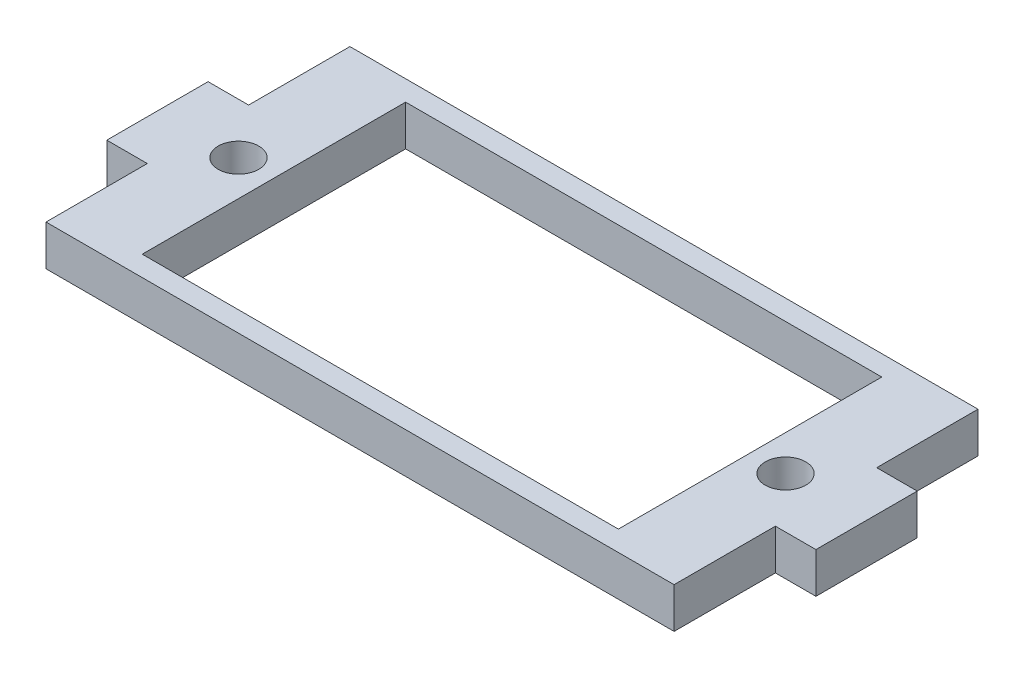
ISO-10303-21;
HEADER;
FILE_DESCRIPTION(('STEP AP214'),'2;1');
FILE_NAME('part.step','',(''),(''),'','','');
FILE_SCHEMA(('AUTOMOTIVE_DESIGN { 1 0 10303 214 1 1 1 1 }'));
ENDSEC;
DATA;
#1=APPLICATION_CONTEXT('core data for automotive mechanical design processes');
#2=APPLICATION_PROTOCOL_DEFINITION('international standard','automotive_design',2000,#1);
#3=PRODUCT_CONTEXT('',#1,'mechanical');
#4=PRODUCT('Part','Part','',(#3));
#5=PRODUCT_RELATED_PRODUCT_CATEGORY('part','',(#4));
#6=PRODUCT_DEFINITION_FORMATION('','',#4);
#7=PRODUCT_DEFINITION_CONTEXT('part definition',#1,'design');
#8=PRODUCT_DEFINITION('design','',#6,#7);
#9=PRODUCT_DEFINITION_SHAPE('','',#8);
#10=(LENGTH_UNIT() NAMED_UNIT(*) SI_UNIT(.MILLI.,.METRE.));
#11=(NAMED_UNIT(*) PLANE_ANGLE_UNIT() SI_UNIT($,.RADIAN.));
#12=(NAMED_UNIT(*) SI_UNIT($,.STERADIAN.) SOLID_ANGLE_UNIT());
#13=UNCERTAINTY_MEASURE_WITH_UNIT(LENGTH_MEASURE(1.E-05),#10,'distance_accuracy_value','');
#14=(GEOMETRIC_REPRESENTATION_CONTEXT(3) GLOBAL_UNCERTAINTY_ASSIGNED_CONTEXT((#13)) GLOBAL_UNIT_ASSIGNED_CONTEXT((#10,
#11,#12)) REPRESENTATION_CONTEXT('',''));
#15=CARTESIAN_POINT('',(0.,0.,0.));
#16=DIRECTION('',(0.,0.,1.));
#17=DIRECTION('',(1.,0.,0.));
#18=AXIS2_PLACEMENT_3D('',#15,#16,#17);
#19=CARTESIAN_POINT('',(0.,2.,0.));
#20=DIRECTION('',(0.,1.,0.));
#21=DIRECTION('',(0.,0.,1.));
#22=AXIS2_PLACEMENT_3D('',#19,#20,#21);
#23=PLANE('',#22);
#24=DIRECTION('',(0.,0.,-1.));
#25=VECTOR('',#24,1.);
#26=CARTESIAN_POINT('',(-15.5,2.,-7.50000000000001));
#27=LINE('',#26,#25);
#28=CARTESIAN_POINT('',(-15.5,2.,-2.50000000000001));
#29=VERTEX_POINT('',#28);
#30=CARTESIAN_POINT('',(-15.5,2.,-7.5));
#31=VERTEX_POINT('',#30);
#32=EDGE_CURVE('E51',#29,#31,#27,.T.);
#33=ORIENTED_EDGE('',*,*,#32,.F.);
#34=DIRECTION('',(1.,0.,0.));
#35=VECTOR('',#34,1.);
#36=CARTESIAN_POINT('',(-17.5,2.,-2.50000000000001));
#37=LINE('',#36,#35);
#38=CARTESIAN_POINT('',(-17.5,2.,-2.50000000000001));
#39=VERTEX_POINT('',#38);
#40=EDGE_CURVE('E510',#39,#29,#37,.T.);
#41=ORIENTED_EDGE('',*,*,#40,.F.);
#42=DIRECTION('',(0.,0.,1.));
#43=VECTOR('',#42,1.);
#44=CARTESIAN_POINT('',(-17.5,2.,7.5));
#45=LINE('',#44,#43);
#46=CARTESIAN_POINT('',(-17.5,2.,2.49999999999999));
#47=VERTEX_POINT('',#46);
#48=EDGE_CURVE('E166',#39,#47,#45,.T.);
#49=ORIENTED_EDGE('',*,*,#48,.T.);
#50=DIRECTION('',(-1.,0.,0.));
#51=VECTOR('',#50,1.);
#52=CARTESIAN_POINT('',(-17.5,2.,2.49999999999999));
#53=LINE('',#52,#51);
#54=CARTESIAN_POINT('',(-15.5,2.,2.49999999999999));
#55=VERTEX_POINT('',#54);
#56=EDGE_CURVE('E346',#55,#47,#53,.T.);
#57=ORIENTED_EDGE('',*,*,#56,.F.);
#58=DIRECTION('',(0.,0.,-1.));
#59=VECTOR('',#58,1.);
#60=CARTESIAN_POINT('',(-15.5,2.,7.49999999999999));
#61=LINE('',#60,#59);
#62=CARTESIAN_POINT('',(-15.5,2.,7.49999999999999));
#63=VERTEX_POINT('',#62);
#64=EDGE_CURVE('E320',#63,#55,#61,.T.);
#65=ORIENTED_EDGE('',*,*,#64,.F.);
#66=DIRECTION('',(1.,0.,0.));
#67=VECTOR('',#66,1.);
#68=CARTESIAN_POINT('',(17.5,2.,7.5));
#69=LINE('',#68,#67);
#70=CARTESIAN_POINT('',(15.5,2.,7.5));
#71=VERTEX_POINT('',#70);
#72=EDGE_CURVE('E191',#63,#71,#69,.T.);
#73=ORIENTED_EDGE('',*,*,#72,.T.);
#74=DIRECTION('',(0.,0.,1.));
#75=VECTOR('',#74,1.);
#76=CARTESIAN_POINT('',(15.5,2.,7.5));
#77=LINE('',#76,#75);
#78=CARTESIAN_POINT('',(15.5,2.,2.5));
#79=VERTEX_POINT('',#78);
#80=EDGE_CURVE('E318',#79,#71,#77,.T.);
#81=ORIENTED_EDGE('',*,*,#80,.F.);
#82=DIRECTION('',(-1.,0.,0.));
#83=VECTOR('',#82,1.);
#84=CARTESIAN_POINT('',(17.5,2.,2.5));
#85=LINE('',#84,#83);
#86=CARTESIAN_POINT('',(17.5,2.,2.5));
#87=VERTEX_POINT('',#86);
#88=EDGE_CURVE('E207',#87,#79,#85,.T.);
#89=ORIENTED_EDGE('',*,*,#88,.F.);
#90=DIRECTION('',(0.,0.,-1.));
#91=VECTOR('',#90,1.);
#92=CARTESIAN_POINT('',(17.5,2.,7.5));
#93=LINE('',#92,#91);
#94=CARTESIAN_POINT('',(17.5,2.,-2.5));
#95=VERTEX_POINT('',#94);
#96=EDGE_CURVE('E43',#87,#95,#93,.T.);
#97=ORIENTED_EDGE('',*,*,#96,.T.);
#98=DIRECTION('',(1.,0.,0.));
#99=VECTOR('',#98,1.);
#100=CARTESIAN_POINT('',(17.5,2.,-2.5));
#101=LINE('',#100,#99);
#102=CARTESIAN_POINT('',(15.5,2.,-2.5));
#103=VERTEX_POINT('',#102);
#104=EDGE_CURVE('E204',#103,#95,#101,.T.);
#105=ORIENTED_EDGE('',*,*,#104,.F.);
#106=DIRECTION('',(0.,0.,1.));
#107=VECTOR('',#106,1.);
#108=CARTESIAN_POINT('',(15.5,2.,-7.5));
#109=LINE('',#108,#107);
#110=CARTESIAN_POINT('',(15.5,2.,-7.5));
#111=VERTEX_POINT('',#110);
#112=EDGE_CURVE('E216',#111,#103,#109,.T.);
#113=ORIENTED_EDGE('',*,*,#112,.F.);
#114=DIRECTION('',(-1.,0.,0.));
#115=VECTOR('',#114,1.);
#116=CARTESIAN_POINT('',(17.5,2.,-7.5));
#117=LINE('',#116,#115);
#118=EDGE_CURVE('E11',#111,#31,#117,.T.);
#119=ORIENTED_EDGE('',*,*,#118,.T.);
#120=EDGE_LOOP('',(#33,#41,#49,#57,#65,#73,#81,#89,#97,#105,#113,#119));
#121=FACE_BOUND('',#120,.T.);
#122=CARTESIAN_POINT('',(-13.5,2.,0.));
#123=DIRECTION('',(0.,1.,0.));
#124=DIRECTION('',(0.,0.,1.));
#125=AXIS2_PLACEMENT_3D('',#122,#123,#124);
#126=CIRCLE('',#125,1.);
#127=CARTESIAN_POINT('',(-13.5,2.,1.));
#128=VERTEX_POINT('',#127);
#129=EDGE_CURVE('E233',#128,#128,#126,.T.);
#130=ORIENTED_EDGE('',*,*,#129,.F.);
#131=EDGE_LOOP('',(#130));
#132=FACE_BOUND('',#131,.T.);
#133=DIRECTION('',(1.,0.,0.));
#134=VECTOR('',#133,1.);
#135=CARTESIAN_POINT('',(11.75,2.,6.5));
#136=LINE('',#135,#134);
#137=CARTESIAN_POINT('',(-11.75,2.,6.5));
#138=VERTEX_POINT('',#137);
#139=CARTESIAN_POINT('',(11.75,2.,6.5));
#140=VERTEX_POINT('',#139);
#141=EDGE_CURVE('E241',#138,#140,#136,.T.);
#142=ORIENTED_EDGE('',*,*,#141,.F.);
#143=DIRECTION('',(0.,0.,1.));
#144=VECTOR('',#143,1.);
#145=CARTESIAN_POINT('',(-11.75,2.,6.5));
#146=LINE('',#145,#144);
#147=CARTESIAN_POINT('',(-11.75,2.,-6.5));
#148=VERTEX_POINT('',#147);
#149=EDGE_CURVE('E239',#148,#138,#146,.T.);
#150=ORIENTED_EDGE('',*,*,#149,.F.);
#151=DIRECTION('',(-1.,0.,0.));
#152=VECTOR('',#151,1.);
#153=CARTESIAN_POINT('',(11.75,2.,-6.5));
#154=LINE('',#153,#152);
#155=CARTESIAN_POINT('',(11.75,2.,-6.5));
#156=VERTEX_POINT('',#155);
#157=EDGE_CURVE('E247',#156,#148,#154,.T.);
#158=ORIENTED_EDGE('',*,*,#157,.F.);
#159=DIRECTION('',(0.,0.,-1.));
#160=VECTOR('',#159,1.);
#161=CARTESIAN_POINT('',(11.75,2.,6.5));
#162=LINE('',#161,#160);
#163=EDGE_CURVE('E244',#140,#156,#162,.T.);
#164=ORIENTED_EDGE('',*,*,#163,.F.);
#165=EDGE_LOOP('',(#142,#150,#158,#164));
#166=FACE_BOUND('',#165,.T.);
#167=CARTESIAN_POINT('',(13.5,2.,0.));
#168=DIRECTION('',(0.,1.,0.));
#169=DIRECTION('',(0.,0.,-1.));
#170=AXIS2_PLACEMENT_3D('',#167,#168,#169);
#171=CIRCLE('',#170,1.);
#172=CARTESIAN_POINT('',(13.5,2.,-0.999999999999995));
#173=VERTEX_POINT('',#172);
#174=EDGE_CURVE('E222',#173,#173,#171,.T.);
#175=ORIENTED_EDGE('',*,*,#174,.F.);
#176=EDGE_LOOP('',(#175));
#177=FACE_BOUND('',#176,.T.);
#178=ADVANCED_FACE('F34',(#121,#132,#166,#177),#23,.T.);
#179=CARTESIAN_POINT('',(0.,0.,0.));
#180=DIRECTION('',(0.,1.,0.));
#181=DIRECTION('',(0.,0.,1.));
#182=AXIS2_PLACEMENT_3D('',#179,#180,#181);
#183=PLANE('',#182);
#184=CARTESIAN_POINT('',(-13.5,0.,0.));
#185=DIRECTION('',(0.,1.,0.));
#186=DIRECTION('',(0.,0.,1.));
#187=AXIS2_PLACEMENT_3D('',#184,#185,#186);
#188=CIRCLE('',#187,1.);
#189=CARTESIAN_POINT('',(-13.5,0.,1.));
#190=VERTEX_POINT('',#189);
#191=EDGE_CURVE('E231',#190,#190,#188,.T.);
#192=ORIENTED_EDGE('',*,*,#191,.T.);
#193=EDGE_LOOP('',(#192));
#194=FACE_BOUND('',#193,.T.);
#195=DIRECTION('',(1.,0.,0.));
#196=VECTOR('',#195,1.);
#197=CARTESIAN_POINT('',(-17.5,0.,-2.50000000000001));
#198=LINE('',#197,#196);
#199=CARTESIAN_POINT('',(-17.5,0.,-2.50000000000001));
#200=VERTEX_POINT('',#199);
#201=CARTESIAN_POINT('',(-15.5,0.,-2.50000000000001));
#202=VERTEX_POINT('',#201);
#203=EDGE_CURVE('E148',#200,#202,#198,.T.);
#204=ORIENTED_EDGE('',*,*,#203,.T.);
#205=DIRECTION('',(0.,0.,-1.));
#206=VECTOR('',#205,1.);
#207=CARTESIAN_POINT('',(-15.5,0.,-7.50000000000001));
#208=LINE('',#207,#206);
#209=CARTESIAN_POINT('',(-15.5,0.,-7.50000000000001));
#210=VERTEX_POINT('',#209);
#211=EDGE_CURVE('E159',#202,#210,#208,.T.);
#212=ORIENTED_EDGE('',*,*,#211,.T.);
#213=DIRECTION('',(-1.,0.,0.));
#214=VECTOR('',#213,1.);
#215=CARTESIAN_POINT('',(17.5,0.,-7.5));
#216=LINE('',#215,#214);
#217=CARTESIAN_POINT('',(15.5,0.,-7.5));
#218=VERTEX_POINT('',#217);
#219=EDGE_CURVE('E38',#218,#210,#216,.T.);
#220=ORIENTED_EDGE('',*,*,#219,.F.);
#221=DIRECTION('',(0.,0.,1.));
#222=VECTOR('',#221,1.);
#223=CARTESIAN_POINT('',(15.5,0.,-7.5));
#224=LINE('',#223,#222);
#225=CARTESIAN_POINT('',(15.5,0.,-2.5));
#226=VERTEX_POINT('',#225);
#227=EDGE_CURVE('E215',#218,#226,#224,.T.);
#228=ORIENTED_EDGE('',*,*,#227,.T.);
#229=DIRECTION('',(1.,0.,0.));
#230=VECTOR('',#229,1.);
#231=CARTESIAN_POINT('',(17.5,0.,-2.5));
#232=LINE('',#231,#230);
#233=CARTESIAN_POINT('',(17.5,0.,-2.5));
#234=VERTEX_POINT('',#233);
#235=EDGE_CURVE('E229',#226,#234,#232,.T.);
#236=ORIENTED_EDGE('',*,*,#235,.T.);
#237=DIRECTION('',(0.,0.,-1.));
#238=VECTOR('',#237,1.);
#239=CARTESIAN_POINT('',(17.5,0.,7.5));
#240=LINE('',#239,#238);
#241=CARTESIAN_POINT('',(17.5,0.,2.5));
#242=VERTEX_POINT('',#241);
#243=EDGE_CURVE('E176',#242,#234,#240,.T.);
#244=ORIENTED_EDGE('',*,*,#243,.F.);
#245=DIRECTION('',(-1.,0.,0.));
#246=VECTOR('',#245,1.);
#247=CARTESIAN_POINT('',(17.5,0.,2.5));
#248=LINE('',#247,#246);
#249=CARTESIAN_POINT('',(15.5,0.,2.5));
#250=VERTEX_POINT('',#249);
#251=EDGE_CURVE('E326',#242,#250,#248,.T.);
#252=ORIENTED_EDGE('',*,*,#251,.T.);
#253=DIRECTION('',(0.,0.,1.));
#254=VECTOR('',#253,1.);
#255=CARTESIAN_POINT('',(15.5,0.,7.5));
#256=LINE('',#255,#254);
#257=CARTESIAN_POINT('',(15.5,0.,7.5));
#258=VERTEX_POINT('',#257);
#259=EDGE_CURVE('E329',#250,#258,#256,.T.);
#260=ORIENTED_EDGE('',*,*,#259,.T.);
#261=DIRECTION('',(1.,0.,0.));
#262=VECTOR('',#261,1.);
#263=CARTESIAN_POINT('',(17.5,0.,7.5));
#264=LINE('',#263,#262);
#265=CARTESIAN_POINT('',(-15.5,0.,7.5));
#266=VERTEX_POINT('',#265);
#267=EDGE_CURVE('E173',#266,#258,#264,.T.);
#268=ORIENTED_EDGE('',*,*,#267,.F.);
#269=DIRECTION('',(0.,0.,-1.));
#270=VECTOR('',#269,1.);
#271=CARTESIAN_POINT('',(-15.5,0.,7.49999999999999));
#272=LINE('',#271,#270);
#273=CARTESIAN_POINT('',(-15.5,0.,2.49999999999999));
#274=VERTEX_POINT('',#273);
#275=EDGE_CURVE('E59',#266,#274,#272,.T.);
#276=ORIENTED_EDGE('',*,*,#275,.T.);
#277=DIRECTION('',(-1.,0.,0.));
#278=VECTOR('',#277,1.);
#279=CARTESIAN_POINT('',(-17.5,0.,2.49999999999999));
#280=LINE('',#279,#278);
#281=CARTESIAN_POINT('',(-17.5,0.,2.49999999999999));
#282=VERTEX_POINT('',#281);
#283=EDGE_CURVE('E172',#274,#282,#280,.T.);
#284=ORIENTED_EDGE('',*,*,#283,.T.);
#285=DIRECTION('',(0.,0.,1.));
#286=VECTOR('',#285,1.);
#287=CARTESIAN_POINT('',(-17.5,0.,7.5));
#288=LINE('',#287,#286);
#289=EDGE_CURVE('E164',#200,#282,#288,.T.);
#290=ORIENTED_EDGE('',*,*,#289,.F.);
#291=EDGE_LOOP('',(#204,#212,#220,#228,#236,#244,#252,#260,#268,#276,#284,#290));
#292=FACE_BOUND('',#291,.T.);
#293=DIRECTION('',(0.,0.,1.));
#294=VECTOR('',#293,1.);
#295=CARTESIAN_POINT('',(-11.75,0.,6.5));
#296=LINE('',#295,#294);
#297=CARTESIAN_POINT('',(-11.75,0.,-6.5));
#298=VERTEX_POINT('',#297);
#299=CARTESIAN_POINT('',(-11.75,0.,6.5));
#300=VERTEX_POINT('',#299);
#301=EDGE_CURVE('E236',#298,#300,#296,.T.);
#302=ORIENTED_EDGE('',*,*,#301,.T.);
#303=DIRECTION('',(1.,0.,0.));
#304=VECTOR('',#303,1.);
#305=CARTESIAN_POINT('',(11.75,0.,6.5));
#306=LINE('',#305,#304);
#307=CARTESIAN_POINT('',(11.75,0.,6.5));
#308=VERTEX_POINT('',#307);
#309=EDGE_CURVE('E252',#300,#308,#306,.T.);
#310=ORIENTED_EDGE('',*,*,#309,.T.);
#311=DIRECTION('',(0.,0.,-1.));
#312=VECTOR('',#311,1.);
#313=CARTESIAN_POINT('',(11.75,0.,6.5));
#314=LINE('',#313,#312);
#315=CARTESIAN_POINT('',(11.75,0.,-6.5));
#316=VERTEX_POINT('',#315);
#317=EDGE_CURVE('E255',#308,#316,#314,.T.);
#318=ORIENTED_EDGE('',*,*,#317,.T.);
#319=DIRECTION('',(-1.,0.,0.));
#320=VECTOR('',#319,1.);
#321=CARTESIAN_POINT('',(11.75,0.,-6.5));
#322=LINE('',#321,#320);
#323=EDGE_CURVE('E242',#316,#298,#322,.T.);
#324=ORIENTED_EDGE('',*,*,#323,.T.);
#325=EDGE_LOOP('',(#302,#310,#318,#324));
#326=FACE_BOUND('',#325,.T.);
#327=CARTESIAN_POINT('',(13.5,0.,0.));
#328=DIRECTION('',(0.,1.,0.));
#329=DIRECTION('',(0.,0.,-1.));
#330=AXIS2_PLACEMENT_3D('',#327,#328,#329);
#331=CIRCLE('',#330,1.);
#332=CARTESIAN_POINT('',(13.5,0.,-0.999999999999995));
#333=VERTEX_POINT('',#332);
#334=EDGE_CURVE('E219',#333,#333,#331,.T.);
#335=ORIENTED_EDGE('',*,*,#334,.T.);
#336=EDGE_LOOP('',(#335));
#337=FACE_BOUND('',#336,.T.);
#338=ADVANCED_FACE('F169',(#194,#292,#326,#337),#183,.F.);
#339=CARTESIAN_POINT('',(-17.5,2.,7.5));
#340=DIRECTION('',(1.,0.,0.));
#341=DIRECTION('',(0.,0.,-1.));
#342=AXIS2_PLACEMENT_3D('',#339,#340,#341);
#343=PLANE('',#342);
#344=ORIENTED_EDGE('',*,*,#48,.F.);
#345=DIRECTION('',(0.,1.,0.));
#346=VECTOR('',#345,1.);
#347=CARTESIAN_POINT('',(-17.5,0.,-2.50000000000001));
#348=LINE('',#347,#346);
#349=EDGE_CURVE('E152',#200,#39,#348,.T.);
#350=ORIENTED_EDGE('',*,*,#349,.F.);
#351=ORIENTED_EDGE('',*,*,#289,.T.);
#352=DIRECTION('',(0.,1.,0.));
#353=VECTOR('',#352,1.);
#354=CARTESIAN_POINT('',(-17.5,0.,2.49999999999999));
#355=LINE('',#354,#353);
#356=EDGE_CURVE('E331',#282,#47,#355,.T.);
#357=ORIENTED_EDGE('',*,*,#356,.T.);
#358=EDGE_LOOP('',(#344,#350,#351,#357));
#359=FACE_BOUND('',#358,.T.);
#360=ADVANCED_FACE('F36',(#359),#343,.F.);
#361=CARTESIAN_POINT('',(17.5,2.,7.5));
#362=DIRECTION('',(0.,0.,-1.));
#363=DIRECTION('',(-1.,0.,0.));
#364=AXIS2_PLACEMENT_3D('',#361,#362,#363);
#365=PLANE('',#364);
#366=ORIENTED_EDGE('',*,*,#72,.F.);
#367=DIRECTION('',(0.,1.,0.));
#368=VECTOR('',#367,1.);
#369=CARTESIAN_POINT('',(-15.5,0.,7.49999999999999));
#370=LINE('',#369,#368);
#371=EDGE_CURVE('E312',#266,#63,#370,.T.);
#372=ORIENTED_EDGE('',*,*,#371,.F.);
#373=ORIENTED_EDGE('',*,*,#267,.T.);
#374=DIRECTION('',(0.,1.,0.));
#375=VECTOR('',#374,1.);
#376=CARTESIAN_POINT('',(15.5,0.,7.5));
#377=LINE('',#376,#375);
#378=EDGE_CURVE('E315',#258,#71,#377,.T.);
#379=ORIENTED_EDGE('',*,*,#378,.T.);
#380=EDGE_LOOP('',(#366,#372,#373,#379));
#381=FACE_BOUND('',#380,.T.);
#382=ADVANCED_FACE('F299',(#381),#365,.F.);
#383=CARTESIAN_POINT('',(17.5,2.,7.5));
#384=DIRECTION('',(-1.,0.,0.));
#385=DIRECTION('',(0.,0.,1.));
#386=AXIS2_PLACEMENT_3D('',#383,#384,#385);
#387=PLANE('',#386);
#388=ORIENTED_EDGE('',*,*,#96,.F.);
#389=DIRECTION('',(0.,1.,0.));
#390=VECTOR('',#389,1.);
#391=CARTESIAN_POINT('',(17.5,0.,2.5));
#392=LINE('',#391,#390);
#393=EDGE_CURVE('E337',#242,#87,#392,.T.);
#394=ORIENTED_EDGE('',*,*,#393,.F.);
#395=ORIENTED_EDGE('',*,*,#243,.T.);
#396=DIRECTION('',(0.,1.,0.));
#397=VECTOR('',#396,1.);
#398=CARTESIAN_POINT('',(17.5,0.,-2.5));
#399=LINE('',#398,#397);
#400=EDGE_CURVE('E211',#234,#95,#399,.T.);
#401=ORIENTED_EDGE('',*,*,#400,.T.);
#402=EDGE_LOOP('',(#388,#394,#395,#401));
#403=FACE_BOUND('',#402,.T.);
#404=ADVANCED_FACE('F218',(#403),#387,.F.);
#405=CARTESIAN_POINT('',(17.5,2.,-7.5));
#406=DIRECTION('',(0.,0.,1.));
#407=DIRECTION('',(1.,0.,0.));
#408=AXIS2_PLACEMENT_3D('',#405,#406,#407);
#409=PLANE('',#408);
#410=ORIENTED_EDGE('',*,*,#219,.T.);
#411=DIRECTION('',(0.,1.,0.));
#412=VECTOR('',#411,1.);
#413=CARTESIAN_POINT('',(-15.5,0.,-7.50000000000001));
#414=LINE('',#413,#412);
#415=EDGE_CURVE('E344',#210,#31,#414,.T.);
#416=ORIENTED_EDGE('',*,*,#415,.T.);
#417=ORIENTED_EDGE('',*,*,#118,.F.);
#418=DIRECTION('',(0.,1.,0.));
#419=VECTOR('',#418,1.);
#420=CARTESIAN_POINT('',(15.5,0.,-7.5));
#421=LINE('',#420,#419);
#422=EDGE_CURVE('E224',#218,#111,#421,.T.);
#423=ORIENTED_EDGE('',*,*,#422,.F.);
#424=EDGE_LOOP('',(#410,#416,#417,#423));
#425=FACE_BOUND('',#424,.T.);
#426=ADVANCED_FACE('F302',(#425),#409,.F.);
#427=CARTESIAN_POINT('',(-11.75,2.,6.5));
#428=DIRECTION('',(1.,0.,0.));
#429=DIRECTION('',(0.,0.,-1.));
#430=AXIS2_PLACEMENT_3D('',#427,#428,#429);
#431=PLANE('',#430);
#432=ORIENTED_EDGE('',*,*,#301,.F.);
#433=DIRECTION('',(0.,-1.,0.));
#434=VECTOR('',#433,1.);
#435=CARTESIAN_POINT('',(-11.75,2.,-6.5));
#436=LINE('',#435,#434);
#437=EDGE_CURVE('E249',#148,#298,#436,.T.);
#438=ORIENTED_EDGE('',*,*,#437,.F.);
#439=ORIENTED_EDGE('',*,*,#149,.T.);
#440=DIRECTION('',(0.,-1.,0.));
#441=VECTOR('',#440,1.);
#442=CARTESIAN_POINT('',(-11.75,2.,6.5));
#443=LINE('',#442,#441);
#444=EDGE_CURVE('E174',#138,#300,#443,.T.);
#445=ORIENTED_EDGE('',*,*,#444,.T.);
#446=EDGE_LOOP('',(#432,#438,#439,#445));
#447=FACE_BOUND('',#446,.T.);
#448=ADVANCED_FACE('F276',(#447),#431,.T.);
#449=CARTESIAN_POINT('',(11.75,2.,6.5));
#450=DIRECTION('',(0.,0.,-1.));
#451=DIRECTION('',(-1.,0.,0.));
#452=AXIS2_PLACEMENT_3D('',#449,#450,#451);
#453=PLANE('',#452);
#454=ORIENTED_EDGE('',*,*,#309,.F.);
#455=ORIENTED_EDGE('',*,*,#444,.F.);
#456=ORIENTED_EDGE('',*,*,#141,.T.);
#457=DIRECTION('',(0.,-1.,0.));
#458=VECTOR('',#457,1.);
#459=CARTESIAN_POINT('',(11.75,2.,6.5));
#460=LINE('',#459,#458);
#461=EDGE_CURVE('E179',#140,#308,#460,.T.);
#462=ORIENTED_EDGE('',*,*,#461,.T.);
#463=EDGE_LOOP('',(#454,#455,#456,#462));
#464=FACE_BOUND('',#463,.T.);
#465=ADVANCED_FACE('F266',(#464),#453,.T.);
#466=CARTESIAN_POINT('',(11.75,2.,6.5));
#467=DIRECTION('',(-1.,0.,0.));
#468=DIRECTION('',(0.,0.,1.));
#469=AXIS2_PLACEMENT_3D('',#466,#467,#468);
#470=PLANE('',#469);
#471=ORIENTED_EDGE('',*,*,#317,.F.);
#472=ORIENTED_EDGE('',*,*,#461,.F.);
#473=ORIENTED_EDGE('',*,*,#163,.T.);
#474=DIRECTION('',(0.,-1.,0.));
#475=VECTOR('',#474,1.);
#476=CARTESIAN_POINT('',(11.75,2.,-6.5));
#477=LINE('',#476,#475);
#478=EDGE_CURVE('E262',#156,#316,#477,.T.);
#479=ORIENTED_EDGE('',*,*,#478,.T.);
#480=EDGE_LOOP('',(#471,#472,#473,#479));
#481=FACE_BOUND('',#480,.T.);
#482=ADVANCED_FACE('F271',(#481),#470,.T.);
#483=CARTESIAN_POINT('',(11.75,2.,-6.5));
#484=DIRECTION('',(0.,0.,1.));
#485=DIRECTION('',(1.,0.,0.));
#486=AXIS2_PLACEMENT_3D('',#483,#484,#485);
#487=PLANE('',#486);
#488=ORIENTED_EDGE('',*,*,#323,.F.);
#489=ORIENTED_EDGE('',*,*,#478,.F.);
#490=ORIENTED_EDGE('',*,*,#157,.T.);
#491=ORIENTED_EDGE('',*,*,#437,.T.);
#492=EDGE_LOOP('',(#488,#489,#490,#491));
#493=FACE_BOUND('',#492,.T.);
#494=ADVANCED_FACE('F279',(#493),#487,.T.);
#495=CARTESIAN_POINT('',(-13.5,2.,0.));
#496=DIRECTION('',(0.,-1.,0.));
#497=DIRECTION('',(0.,0.,-1.));
#498=AXIS2_PLACEMENT_3D('',#495,#496,#497);
#499=CYLINDRICAL_SURFACE('',#498,1.);
#500=ORIENTED_EDGE('',*,*,#129,.T.);
#501=EDGE_LOOP('',(#500));
#502=FACE_BOUND('',#501,.T.);
#503=ORIENTED_EDGE('',*,*,#191,.F.);
#504=EDGE_LOOP('',(#503));
#505=FACE_BOUND('',#504,.T.);
#506=ADVANCED_FACE('F290',(#502,#505),#499,.F.);
#507=CARTESIAN_POINT('',(13.5,2.,0.));
#508=DIRECTION('',(0.,-1.,0.));
#509=DIRECTION('',(0.,0.,-1.));
#510=AXIS2_PLACEMENT_3D('',#507,#508,#509);
#511=CYLINDRICAL_SURFACE('',#510,1.);
#512=ORIENTED_EDGE('',*,*,#174,.T.);
#513=EDGE_LOOP('',(#512));
#514=FACE_BOUND('',#513,.T.);
#515=ORIENTED_EDGE('',*,*,#334,.F.);
#516=EDGE_LOOP('',(#515));
#517=FACE_BOUND('',#516,.T.);
#518=ADVANCED_FACE('F287',(#514,#517),#511,.F.);
#519=CARTESIAN_POINT('',(17.5,0.,-2.5));
#520=DIRECTION('',(0.,0.,1.));
#521=DIRECTION('',(1.,0.,0.));
#522=AXIS2_PLACEMENT_3D('',#519,#520,#521);
#523=PLANE('',#522);
#524=ORIENTED_EDGE('',*,*,#104,.T.);
#525=ORIENTED_EDGE('',*,*,#400,.F.);
#526=ORIENTED_EDGE('',*,*,#235,.F.);
#527=DIRECTION('',(0.,1.,0.));
#528=VECTOR('',#527,1.);
#529=CARTESIAN_POINT('',(15.5,0.,-2.5));
#530=LINE('',#529,#528);
#531=EDGE_CURVE('E213',#226,#103,#530,.T.);
#532=ORIENTED_EDGE('',*,*,#531,.T.);
#533=EDGE_LOOP('',(#524,#525,#526,#532));
#534=FACE_BOUND('',#533,.T.);
#535=ADVANCED_FACE('F209',(#534),#523,.F.);
#536=CARTESIAN_POINT('',(15.5,0.,-7.5));
#537=DIRECTION('',(-1.,0.,0.));
#538=DIRECTION('',(0.,0.,1.));
#539=AXIS2_PLACEMENT_3D('',#536,#537,#538);
#540=PLANE('',#539);
#541=ORIENTED_EDGE('',*,*,#112,.T.);
#542=ORIENTED_EDGE('',*,*,#531,.F.);
#543=ORIENTED_EDGE('',*,*,#227,.F.);
#544=ORIENTED_EDGE('',*,*,#422,.T.);
#545=EDGE_LOOP('',(#541,#542,#543,#544));
#546=FACE_BOUND('',#545,.T.);
#547=ADVANCED_FACE('F342',(#546),#540,.F.);
#548=CARTESIAN_POINT('',(15.5,0.,7.5));
#549=DIRECTION('',(-1.,0.,0.));
#550=DIRECTION('',(0.,0.,1.));
#551=AXIS2_PLACEMENT_3D('',#548,#549,#550);
#552=PLANE('',#551);
#553=ORIENTED_EDGE('',*,*,#80,.T.);
#554=ORIENTED_EDGE('',*,*,#378,.F.);
#555=ORIENTED_EDGE('',*,*,#259,.F.);
#556=DIRECTION('',(0.,1.,0.));
#557=VECTOR('',#556,1.);
#558=CARTESIAN_POINT('',(15.5,0.,2.5));
#559=LINE('',#558,#557);
#560=EDGE_CURVE('E325',#250,#79,#559,.T.);
#561=ORIENTED_EDGE('',*,*,#560,.T.);
#562=EDGE_LOOP('',(#553,#554,#555,#561));
#563=FACE_BOUND('',#562,.T.);
#564=ADVANCED_FACE('F322',(#563),#552,.F.);
#565=CARTESIAN_POINT('',(17.5,0.,2.5));
#566=DIRECTION('',(0.,0.,-1.));
#567=DIRECTION('',(-1.,0.,0.));
#568=AXIS2_PLACEMENT_3D('',#565,#566,#567);
#569=PLANE('',#568);
#570=ORIENTED_EDGE('',*,*,#88,.T.);
#571=ORIENTED_EDGE('',*,*,#560,.F.);
#572=ORIENTED_EDGE('',*,*,#251,.F.);
#573=ORIENTED_EDGE('',*,*,#393,.T.);
#574=EDGE_LOOP('',(#570,#571,#572,#573));
#575=FACE_BOUND('',#574,.T.);
#576=ADVANCED_FACE('F359',(#575),#569,.F.);
#577=CARTESIAN_POINT('',(-17.5,0.,2.49999999999999));
#578=DIRECTION('',(0.,0.,-1.));
#579=DIRECTION('',(-1.,0.,0.));
#580=AXIS2_PLACEMENT_3D('',#577,#578,#579);
#581=PLANE('',#580);
#582=ORIENTED_EDGE('',*,*,#56,.T.);
#583=ORIENTED_EDGE('',*,*,#356,.F.);
#584=ORIENTED_EDGE('',*,*,#283,.F.);
#585=DIRECTION('',(0.,1.,0.));
#586=VECTOR('',#585,1.);
#587=CARTESIAN_POINT('',(-15.5,0.,2.49999999999999));
#588=LINE('',#587,#586);
#589=EDGE_CURVE('E356',#274,#55,#588,.T.);
#590=ORIENTED_EDGE('',*,*,#589,.T.);
#591=EDGE_LOOP('',(#582,#583,#584,#590));
#592=FACE_BOUND('',#591,.T.);
#593=ADVANCED_FACE('F361',(#592),#581,.F.);
#594=CARTESIAN_POINT('',(-15.5,0.,7.49999999999999));
#595=DIRECTION('',(1.,0.,0.));
#596=DIRECTION('',(0.,0.,-1.));
#597=AXIS2_PLACEMENT_3D('',#594,#595,#596);
#598=PLANE('',#597);
#599=ORIENTED_EDGE('',*,*,#64,.T.);
#600=ORIENTED_EDGE('',*,*,#589,.F.);
#601=ORIENTED_EDGE('',*,*,#275,.F.);
#602=ORIENTED_EDGE('',*,*,#371,.T.);
#603=EDGE_LOOP('',(#599,#600,#601,#602));
#604=FACE_BOUND('',#603,.T.);
#605=ADVANCED_FACE('F367',(#604),#598,.F.);
#606=CARTESIAN_POINT('',(-15.5,0.,-7.50000000000001));
#607=DIRECTION('',(1.,0.,0.));
#608=DIRECTION('',(0.,0.,-1.));
#609=AXIS2_PLACEMENT_3D('',#606,#607,#608);
#610=PLANE('',#609);
#611=ORIENTED_EDGE('',*,*,#32,.T.);
#612=ORIENTED_EDGE('',*,*,#415,.F.);
#613=ORIENTED_EDGE('',*,*,#211,.F.);
#614=DIRECTION('',(0.,1.,0.));
#615=VECTOR('',#614,1.);
#616=CARTESIAN_POINT('',(-15.5,0.,-2.50000000000001));
#617=LINE('',#616,#615);
#618=EDGE_CURVE('E154',#202,#29,#617,.T.);
#619=ORIENTED_EDGE('',*,*,#618,.T.);
#620=EDGE_LOOP('',(#611,#612,#613,#619));
#621=FACE_BOUND('',#620,.T.);
#622=ADVANCED_FACE('F442',(#621),#610,.F.);
#623=CARTESIAN_POINT('',(-17.5,0.,-2.50000000000001));
#624=DIRECTION('',(0.,0.,1.));
#625=DIRECTION('',(1.,0.,0.));
#626=AXIS2_PLACEMENT_3D('',#623,#624,#625);
#627=PLANE('',#626);
#628=ORIENTED_EDGE('',*,*,#40,.T.);
#629=ORIENTED_EDGE('',*,*,#618,.F.);
#630=ORIENTED_EDGE('',*,*,#203,.F.);
#631=ORIENTED_EDGE('',*,*,#349,.T.);
#632=EDGE_LOOP('',(#628,#629,#630,#631));
#633=FACE_BOUND('',#632,.T.);
#634=ADVANCED_FACE('F151',(#633),#627,.F.);
#635=CLOSED_SHELL('',(#178,#338,#360,#382,#404,#426,#448,#465,#482,#494,#506,#518,#535,#547,
#564,#576,#593,#605,#622,#634));
#636=MANIFOLD_SOLID_BREP('B2',#635);
#637=ADVANCED_BREP_SHAPE_REPRESENTATION('',(#18,#636),#14);
#638=SHAPE_DEFINITION_REPRESENTATION(#9,#637);
ENDSEC;
END-ISO-10303-21;
